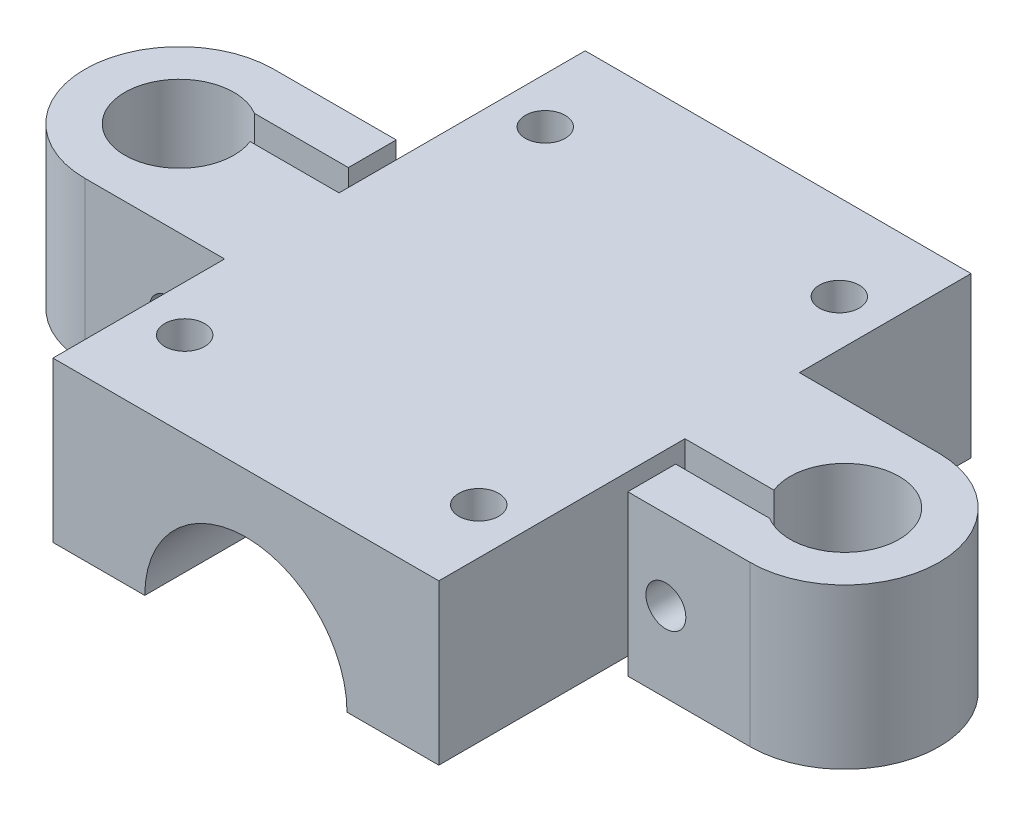
ISO-10303-21;
HEADER;
FILE_DESCRIPTION(('STEP AP214'),'2;1');
FILE_NAME('part.step','',(''),(''),'','','');
FILE_SCHEMA(('AUTOMOTIVE_DESIGN { 1 0 10303 214 1 1 1 1 }'));
ENDSEC;
DATA;
#1=APPLICATION_CONTEXT('core data for automotive mechanical design processes');
#2=APPLICATION_PROTOCOL_DEFINITION('international standard','automotive_design',2000,#1);
#3=PRODUCT_CONTEXT('',#1,'mechanical');
#4=PRODUCT('Part','Part','',(#3));
#5=PRODUCT_RELATED_PRODUCT_CATEGORY('part','',(#4));
#6=PRODUCT_DEFINITION_FORMATION('','',#4);
#7=PRODUCT_DEFINITION_CONTEXT('part definition',#1,'design');
#8=PRODUCT_DEFINITION('design','',#6,#7);
#9=PRODUCT_DEFINITION_SHAPE('','',#8);
#10=(LENGTH_UNIT() NAMED_UNIT(*) SI_UNIT(.MILLI.,.METRE.));
#11=(NAMED_UNIT(*) PLANE_ANGLE_UNIT() SI_UNIT($,.RADIAN.));
#12=(NAMED_UNIT(*) SI_UNIT($,.STERADIAN.) SOLID_ANGLE_UNIT());
#13=UNCERTAINTY_MEASURE_WITH_UNIT(LENGTH_MEASURE(1.E-05),#10,'distance_accuracy_value','');
#14=(GEOMETRIC_REPRESENTATION_CONTEXT(3) GLOBAL_UNCERTAINTY_ASSIGNED_CONTEXT((#13)) GLOBAL_UNIT_ASSIGNED_CONTEXT((#10,
#11,#12)) REPRESENTATION_CONTEXT('',''));
#15=CARTESIAN_POINT('',(0.,0.,0.));
#16=DIRECTION('',(0.,0.,1.));
#17=DIRECTION('',(1.,0.,0.));
#18=AXIS2_PLACEMENT_3D('',#15,#16,#17);
#19=CARTESIAN_POINT('',(0.,0.,-20.));
#20=DIRECTION('',(1.,0.,0.));
#21=DIRECTION('',(0.,0.,-1.));
#22=AXIS2_PLACEMENT_3D('',#19,#20,#21);
#23=PLANE('',#22);
#24=DIRECTION('',(0.,1.,0.));
#25=VECTOR('',#24,1.);
#26=CARTESIAN_POINT('',(0.,-22.6141548592911,7.1));
#27=LINE('',#26,#25);
#28=CARTESIAN_POINT('',(0.,0.,7.1));
#29=VERTEX_POINT('',#28);
#30=CARTESIAN_POINT('',(0.,12.,7.1));
#31=VERTEX_POINT('',#30);
#32=EDGE_CURVE('E72',#29,#31,#27,.T.);
#33=ORIENTED_EDGE('',*,*,#32,.F.);
#34=DIRECTION('',(0.,0.,1.));
#35=VECTOR('',#34,1.);
#36=CARTESIAN_POINT('',(0.,0.,-20.));
#37=LINE('',#36,#35);
#38=CARTESIAN_POINT('',(0.,0.,20.));
#39=VERTEX_POINT('',#38);
#40=EDGE_CURVE('E345',#29,#39,#37,.T.);
#41=ORIENTED_EDGE('',*,*,#40,.T.);
#42=DIRECTION('',(0.,1.,0.));
#43=VECTOR('',#42,1.);
#44=CARTESIAN_POINT('',(0.,0.,20.));
#45=LINE('',#44,#43);
#46=CARTESIAN_POINT('',(0.,12.,20.));
#47=VERTEX_POINT('',#46);
#48=EDGE_CURVE('E322',#39,#47,#45,.T.);
#49=ORIENTED_EDGE('',*,*,#48,.T.);
#50=DIRECTION('',(0.,0.,1.));
#51=VECTOR('',#50,1.);
#52=CARTESIAN_POINT('',(0.,12.,-20.));
#53=LINE('',#52,#51);
#54=EDGE_CURVE('E348',#31,#47,#53,.T.);
#55=ORIENTED_EDGE('',*,*,#54,.F.);
#56=EDGE_LOOP('',(#33,#41,#49,#55));
#57=FACE_BOUND('',#56,.T.);
#58=ADVANCED_FACE('F47',(#57),#23,.F.);
#59=CARTESIAN_POINT('',(29.,0.,-20.));
#60=DIRECTION('',(1.,0.,0.));
#61=DIRECTION('',(0.,0.,-1.));
#62=AXIS2_PLACEMENT_3D('',#59,#60,#61);
#63=PLANE('',#62);
#64=DIRECTION('',(0.,0.,1.));
#65=VECTOR('',#64,1.);
#66=CARTESIAN_POINT('',(29.,0.,-20.));
#67=LINE('',#66,#65);
#68=CARTESIAN_POINT('',(29.,0.,1.49999999999999));
#69=VERTEX_POINT('',#68);
#70=CARTESIAN_POINT('',(29.,0.,20.));
#71=VERTEX_POINT('',#70);
#72=EDGE_CURVE('E355',#69,#71,#67,.T.);
#73=ORIENTED_EDGE('',*,*,#72,.F.);
#74=DIRECTION('',(0.,1.,0.));
#75=VECTOR('',#74,1.);
#76=CARTESIAN_POINT('',(29.,-22.6141548592911,1.5));
#77=LINE('',#76,#75);
#78=CARTESIAN_POINT('',(29.,12.,1.49999999999999));
#79=VERTEX_POINT('',#78);
#80=EDGE_CURVE('E260',#69,#79,#77,.T.);
#81=ORIENTED_EDGE('',*,*,#80,.T.);
#82=DIRECTION('',(0.,0.,1.));
#83=VECTOR('',#82,1.);
#84=CARTESIAN_POINT('',(29.,12.,-20.));
#85=LINE('',#84,#83);
#86=CARTESIAN_POINT('',(29.,12.,20.));
#87=VERTEX_POINT('',#86);
#88=EDGE_CURVE('E351',#79,#87,#85,.T.);
#89=ORIENTED_EDGE('',*,*,#88,.T.);
#90=DIRECTION('',(0.,1.,0.));
#91=VECTOR('',#90,1.);
#92=CARTESIAN_POINT('',(29.,0.,20.));
#93=LINE('',#92,#91);
#94=EDGE_CURVE('E316',#71,#87,#93,.T.);
#95=ORIENTED_EDGE('',*,*,#94,.F.);
#96=EDGE_LOOP('',(#73,#81,#89,#95));
#97=FACE_BOUND('',#96,.T.);
#98=ADVANCED_FACE('F414',(#97),#63,.T.);
#99=CARTESIAN_POINT('',(14.5,0.,-20.));
#100=DIRECTION('',(0.,0.,1.));
#101=DIRECTION('',(1.,0.,0.));
#102=AXIS2_PLACEMENT_3D('',#99,#100,#101);
#103=CYLINDRICAL_SURFACE('',#102,7.6);
#104=DIRECTION('',(0.,0.,1.));
#105=VECTOR('',#104,1.);
#106=CARTESIAN_POINT('',(22.1,0.,-20.));
#107=LINE('',#106,#105);
#108=CARTESIAN_POINT('',(22.1,0.,-20.));
#109=VERTEX_POINT('',#108);
#110=CARTESIAN_POINT('',(22.1,0.,20.));
#111=VERTEX_POINT('',#110);
#112=EDGE_CURVE('E342',#109,#111,#107,.T.);
#113=ORIENTED_EDGE('',*,*,#112,.T.);
#114=CARTESIAN_POINT('',(14.5,0.,20.));
#115=DIRECTION('',(0.,0.,1.));
#116=DIRECTION('',(1.,0.,0.));
#117=AXIS2_PLACEMENT_3D('',#114,#115,#116);
#118=CIRCLE('',#117,7.6);
#119=CARTESIAN_POINT('',(6.9,0.,20.));
#120=VERTEX_POINT('',#119);
#121=EDGE_CURVE('E224',#111,#120,#118,.T.);
#122=ORIENTED_EDGE('',*,*,#121,.T.);
#123=DIRECTION('',(0.,0.,1.));
#124=VECTOR('',#123,1.);
#125=CARTESIAN_POINT('',(6.9,0.,-20.));
#126=LINE('',#125,#124);
#127=CARTESIAN_POINT('',(6.9,0.,-20.));
#128=VERTEX_POINT('',#127);
#129=EDGE_CURVE('E11',#128,#120,#126,.T.);
#130=ORIENTED_EDGE('',*,*,#129,.F.);
#131=CARTESIAN_POINT('',(14.5,0.,-20.));
#132=DIRECTION('',(0.,0.,1.));
#133=DIRECTION('',(1.,0.,0.));
#134=AXIS2_PLACEMENT_3D('',#131,#132,#133);
#135=CIRCLE('',#134,7.6);
#136=EDGE_CURVE('E328',#109,#128,#135,.T.);
#137=ORIENTED_EDGE('',*,*,#136,.F.);
#138=EDGE_LOOP('',(#113,#122,#130,#137));
#139=FACE_BOUND('',#138,.T.);
#140=ADVANCED_FACE('F49',(#139),#103,.F.);
#141=CARTESIAN_POINT('',(0.,0.,-20.));
#142=DIRECTION('',(0.,-1.,0.));
#143=DIRECTION('',(1.,0.,0.));
#144=AXIS2_PLACEMENT_3D('',#141,#142,#143);
#145=PLANE('',#144);
#146=CARTESIAN_POINT('',(3.45,0.,-13.55));
#147=DIRECTION('',(0.,-1.,0.));
#148=DIRECTION('',(1.,0.,0.));
#149=AXIS2_PLACEMENT_3D('',#146,#147,#148);
#150=CIRCLE('',#149,1.5);
#151=CARTESIAN_POINT('',(4.95,0.,-13.55));
#152=VERTEX_POINT('',#151);
#153=EDGE_CURVE('E510',#152,#152,#150,.T.);
#154=ORIENTED_EDGE('',*,*,#153,.F.);
#155=EDGE_LOOP('',(#154));
#156=FACE_BOUND('',#155,.T.);
#157=CARTESIAN_POINT('',(3.45,0.,13.55));
#158=DIRECTION('',(0.,-1.,0.));
#159=DIRECTION('',(1.,0.,0.));
#160=AXIS2_PLACEMENT_3D('',#157,#158,#159);
#161=CIRCLE('',#160,1.5);
#162=CARTESIAN_POINT('',(4.95,0.,13.55));
#163=VERTEX_POINT('',#162);
#164=EDGE_CURVE('E503',#163,#163,#161,.T.);
#165=ORIENTED_EDGE('',*,*,#164,.F.);
#166=EDGE_LOOP('',(#165));
#167=FACE_BOUND('',#166,.T.);
#168=ORIENTED_EDGE('',*,*,#129,.T.);
#169=DIRECTION('',(1.,0.,0.));
#170=VECTOR('',#169,1.);
#171=CARTESIAN_POINT('',(0.,0.,20.));
#172=LINE('',#171,#170);
#173=EDGE_CURVE('E325',#39,#120,#172,.T.);
#174=ORIENTED_EDGE('',*,*,#173,.F.);
#175=ORIENTED_EDGE('',*,*,#40,.F.);
#176=DIRECTION('',(1.,0.,0.));
#177=VECTOR('',#176,1.);
#178=CARTESIAN_POINT('',(0.,0.,7.10000000000001));
#179=LINE('',#178,#177);
#180=CARTESIAN_POINT('',(-10.5,0.,7.10000000000001));
#181=VERTEX_POINT('',#180);
#182=EDGE_CURVE('E238',#181,#29,#179,.T.);
#183=ORIENTED_EDGE('',*,*,#182,.F.);
#184=CARTESIAN_POINT('',(-10.5,0.,0.));
#185=DIRECTION('',(0.,-1.,0.));
#186=DIRECTION('',(1.,0.,0.));
#187=AXIS2_PLACEMENT_3D('',#184,#185,#186);
#188=CIRCLE('',#187,7.1);
#189=CARTESIAN_POINT('',(-10.5,0.,-7.09999999999999));
#190=VERTEX_POINT('',#189);
#191=EDGE_CURVE('E235',#190,#181,#188,.F.);
#192=ORIENTED_EDGE('',*,*,#191,.F.);
#193=DIRECTION('',(1.,0.,0.));
#194=VECTOR('',#193,1.);
#195=CARTESIAN_POINT('',(0.,0.,-7.09999999999999));
#196=LINE('',#195,#194);
#197=CARTESIAN_POINT('',(-1.3,0.,-7.09999999999999));
#198=VERTEX_POINT('',#197);
#199=EDGE_CURVE('E223',#190,#198,#196,.T.);
#200=ORIENTED_EDGE('',*,*,#199,.T.);
#201=DIRECTION('',(0.,0.,1.));
#202=VECTOR('',#201,1.);
#203=CARTESIAN_POINT('',(-1.3,0.,0.));
#204=LINE('',#203,#202);
#205=CARTESIAN_POINT('',(-1.3,0.,-3.5));
#206=VERTEX_POINT('',#205);
#207=EDGE_CURVE('E201',#198,#206,#204,.T.);
#208=ORIENTED_EDGE('',*,*,#207,.T.);
#209=DIRECTION('',(-1.,0.,0.));
#210=VECTOR('',#209,1.);
#211=CARTESIAN_POINT('',(0.,0.,-3.5));
#212=LINE('',#211,#210);
#213=CARTESIAN_POINT('',(-8.36458434959376,0.,-3.5));
#214=VERTEX_POINT('',#213);
#215=EDGE_CURVE('E211',#206,#214,#212,.T.);
#216=ORIENTED_EDGE('',*,*,#215,.T.);
#217=CARTESIAN_POINT('',(-10.5,0.,0.));
#218=DIRECTION('',(0.,-1.,0.));
#219=DIRECTION('',(1.,0.,0.));
#220=AXIS2_PLACEMENT_3D('',#217,#218,#219);
#221=CIRCLE('',#220,4.1);
#222=CARTESIAN_POINT('',(-6.68424319433222,0.,-1.5));
#223=VERTEX_POINT('',#222);
#224=EDGE_CURVE('E217',#214,#223,#221,.F.);
#225=ORIENTED_EDGE('',*,*,#224,.T.);
#226=DIRECTION('',(1.,0.,0.));
#227=VECTOR('',#226,1.);
#228=CARTESIAN_POINT('',(0.,0.,-1.5));
#229=LINE('',#228,#227);
#230=CARTESIAN_POINT('',(0.,0.,-1.5));
#231=VERTEX_POINT('',#230);
#232=EDGE_CURVE('E229',#223,#231,#229,.T.);
#233=ORIENTED_EDGE('',*,*,#232,.T.);
#234=CARTESIAN_POINT('',(0.,0.,-20.));
#235=VERTEX_POINT('',#234);
#236=EDGE_CURVE('E56',#235,#231,#37,.T.);
#237=ORIENTED_EDGE('',*,*,#236,.F.);
#238=DIRECTION('',(1.,0.,0.));
#239=VECTOR('',#238,1.);
#240=CARTESIAN_POINT('',(0.,0.,-20.));
#241=LINE('',#240,#239);
#242=EDGE_CURVE('E340',#235,#128,#241,.T.);
#243=ORIENTED_EDGE('',*,*,#242,.T.);
#244=EDGE_LOOP('',(#168,#174,#175,#183,#192,#200,#208,#216,#225,#233,#237,#243));
#245=FACE_BOUND('',#244,.T.);
#246=ADVANCED_FACE('F221',(#156,#167,#245),#145,.T.);
#247=ORIENTED_EDGE('',*,*,#236,.T.);
#248=DIRECTION('',(0.,1.,0.));
#249=VECTOR('',#248,1.);
#250=CARTESIAN_POINT('',(0.,-22.6141548592911,-1.5));
#251=LINE('',#250,#249);
#252=CARTESIAN_POINT('',(0.,12.,-1.5));
#253=VERTEX_POINT('',#252);
#254=EDGE_CURVE('E64',#231,#253,#251,.T.);
#255=ORIENTED_EDGE('',*,*,#254,.T.);
#256=CARTESIAN_POINT('',(0.,12.,-20.));
#257=VERTEX_POINT('',#256);
#258=EDGE_CURVE('E346',#257,#253,#53,.T.);
#259=ORIENTED_EDGE('',*,*,#258,.F.);
#260=DIRECTION('',(0.,1.,0.));
#261=VECTOR('',#260,1.);
#262=CARTESIAN_POINT('',(0.,0.,-20.));
#263=LINE('',#262,#261);
#264=EDGE_CURVE('E338',#235,#257,#263,.T.);
#265=ORIENTED_EDGE('',*,*,#264,.F.);
#266=EDGE_LOOP('',(#247,#255,#259,#265));
#267=FACE_BOUND('',#266,.T.);
#268=ADVANCED_FACE('F416',(#267),#23,.F.);
#269=CARTESIAN_POINT('',(0.,12.,-20.));
#270=DIRECTION('',(0.,-1.,0.));
#271=DIRECTION('',(0.,0.,-1.));
#272=AXIS2_PLACEMENT_3D('',#269,#270,#271);
#273=PLANE('',#272);
#274=CARTESIAN_POINT('',(25.55,12.,13.55));
#275=DIRECTION('',(0.,-1.,0.));
#276=DIRECTION('',(1.,0.,0.));
#277=AXIS2_PLACEMENT_3D('',#274,#275,#276);
#278=CIRCLE('',#277,1.5);
#279=CARTESIAN_POINT('',(27.05,12.,13.55));
#280=VERTEX_POINT('',#279);
#281=EDGE_CURVE('E519',#280,#280,#278,.T.);
#282=ORIENTED_EDGE('',*,*,#281,.T.);
#283=EDGE_LOOP('',(#282));
#284=FACE_BOUND('',#283,.T.);
#285=CARTESIAN_POINT('',(3.45,12.,-13.55));
#286=DIRECTION('',(0.,-1.,0.));
#287=DIRECTION('',(1.,0.,0.));
#288=AXIS2_PLACEMENT_3D('',#285,#286,#287);
#289=CIRCLE('',#288,1.5);
#290=CARTESIAN_POINT('',(4.94999999999999,12.,-13.55));
#291=VERTEX_POINT('',#290);
#292=EDGE_CURVE('E515',#291,#291,#289,.T.);
#293=ORIENTED_EDGE('',*,*,#292,.T.);
#294=EDGE_LOOP('',(#293));
#295=FACE_BOUND('',#294,.T.);
#296=CARTESIAN_POINT('',(25.55,12.,-13.55));
#297=DIRECTION('',(0.,-1.,0.));
#298=DIRECTION('',(1.,0.,0.));
#299=AXIS2_PLACEMENT_3D('',#296,#297,#298);
#300=CIRCLE('',#299,1.5);
#301=CARTESIAN_POINT('',(27.05,12.,-13.55));
#302=VERTEX_POINT('',#301);
#303=EDGE_CURVE('E504',#302,#302,#300,.T.);
#304=ORIENTED_EDGE('',*,*,#303,.T.);
#305=EDGE_LOOP('',(#304));
#306=FACE_BOUND('',#305,.T.);
#307=CARTESIAN_POINT('',(3.45,12.,13.55));
#308=DIRECTION('',(0.,-1.,0.));
#309=DIRECTION('',(1.,0.,0.));
#310=AXIS2_PLACEMENT_3D('',#307,#308,#309);
#311=CIRCLE('',#310,1.5);
#312=CARTESIAN_POINT('',(4.94999999999999,12.,13.55));
#313=VERTEX_POINT('',#312);
#314=EDGE_CURVE('E507',#313,#313,#311,.T.);
#315=ORIENTED_EDGE('',*,*,#314,.T.);
#316=EDGE_LOOP('',(#315));
#317=FACE_BOUND('',#316,.T.);
#318=ORIENTED_EDGE('',*,*,#258,.T.);
#319=DIRECTION('',(1.,0.,0.));
#320=VECTOR('',#319,1.);
#321=CARTESIAN_POINT('',(0.,12.,-1.5));
#322=LINE('',#321,#320);
#323=CARTESIAN_POINT('',(-6.68424319433222,12.,-1.5));
#324=VERTEX_POINT('',#323);
#325=EDGE_CURVE('E246',#324,#253,#322,.T.);
#326=ORIENTED_EDGE('',*,*,#325,.F.);
#327=CARTESIAN_POINT('',(-10.5,12.,0.));
#328=DIRECTION('',(0.,1.,0.));
#329=DIRECTION('',(0.,0.,1.));
#330=AXIS2_PLACEMENT_3D('',#327,#328,#329);
#331=CIRCLE('',#330,4.1);
#332=CARTESIAN_POINT('',(-8.36458434959376,12.,-3.5));
#333=VERTEX_POINT('',#332);
#334=EDGE_CURVE('E232',#333,#324,#331,.T.);
#335=ORIENTED_EDGE('',*,*,#334,.F.);
#336=DIRECTION('',(-1.,0.,0.));
#337=VECTOR('',#336,1.);
#338=CARTESIAN_POINT('',(0.,12.,-3.5));
#339=LINE('',#338,#337);
#340=CARTESIAN_POINT('',(-1.3,12.,-3.5));
#341=VERTEX_POINT('',#340);
#342=EDGE_CURVE('E208',#341,#333,#339,.T.);
#343=ORIENTED_EDGE('',*,*,#342,.F.);
#344=DIRECTION('',(0.,0.,1.));
#345=VECTOR('',#344,1.);
#346=CARTESIAN_POINT('',(-1.3,12.,0.));
#347=LINE('',#346,#345);
#348=CARTESIAN_POINT('',(-1.3,12.,-7.09999999999999));
#349=VERTEX_POINT('',#348);
#350=EDGE_CURVE('E204',#349,#341,#347,.T.);
#351=ORIENTED_EDGE('',*,*,#350,.F.);
#352=DIRECTION('',(1.,0.,0.));
#353=VECTOR('',#352,1.);
#354=CARTESIAN_POINT('',(0.,12.,-7.09999999999999));
#355=LINE('',#354,#353);
#356=CARTESIAN_POINT('',(-10.5,12.,-7.09999999999999));
#357=VERTEX_POINT('',#356);
#358=EDGE_CURVE('E252',#357,#349,#355,.T.);
#359=ORIENTED_EDGE('',*,*,#358,.F.);
#360=CARTESIAN_POINT('',(-10.5,12.,0.));
#361=DIRECTION('',(0.,1.,0.));
#362=DIRECTION('',(0.,0.,1.));
#363=AXIS2_PLACEMENT_3D('',#360,#361,#362);
#364=CIRCLE('',#363,7.1);
#365=CARTESIAN_POINT('',(-10.5,12.,7.10000000000001));
#366=VERTEX_POINT('',#365);
#367=EDGE_CURVE('E383',#357,#366,#364,.T.);
#368=ORIENTED_EDGE('',*,*,#367,.T.);
#369=DIRECTION('',(1.,0.,0.));
#370=VECTOR('',#369,1.);
#371=CARTESIAN_POINT('',(0.,12.,7.10000000000001));
#372=LINE('',#371,#370);
#373=EDGE_CURVE('E218',#366,#31,#372,.T.);
#374=ORIENTED_EDGE('',*,*,#373,.T.);
#375=ORIENTED_EDGE('',*,*,#54,.T.);
#376=DIRECTION('',(1.,0.,0.));
#377=VECTOR('',#376,1.);
#378=CARTESIAN_POINT('',(0.,12.,20.));
#379=LINE('',#378,#377);
#380=EDGE_CURVE('E319',#47,#87,#379,.T.);
#381=ORIENTED_EDGE('',*,*,#380,.T.);
#382=ORIENTED_EDGE('',*,*,#88,.F.);
#383=DIRECTION('',(-1.,0.,0.));
#384=VECTOR('',#383,1.);
#385=CARTESIAN_POINT('',(0.,12.,1.5));
#386=LINE('',#385,#384);
#387=CARTESIAN_POINT('',(35.6842431943322,12.,1.5));
#388=VERTEX_POINT('',#387);
#389=EDGE_CURVE('E257',#388,#79,#386,.T.);
#390=ORIENTED_EDGE('',*,*,#389,.F.);
#391=CARTESIAN_POINT('',(39.5,12.,0.));
#392=DIRECTION('',(0.,1.,0.));
#393=DIRECTION('',(0.,0.,1.));
#394=AXIS2_PLACEMENT_3D('',#391,#392,#393);
#395=CIRCLE('',#394,4.1);
#396=CARTESIAN_POINT('',(37.3645843495937,12.,3.49999999999999));
#397=VERTEX_POINT('',#396);
#398=EDGE_CURVE('E282',#397,#388,#395,.T.);
#399=ORIENTED_EDGE('',*,*,#398,.F.);
#400=DIRECTION('',(1.,0.,0.));
#401=VECTOR('',#400,1.);
#402=CARTESIAN_POINT('',(0.,12.,3.5));
#403=LINE('',#402,#401);
#404=CARTESIAN_POINT('',(30.3,12.,3.5));
#405=VERTEX_POINT('',#404);
#406=EDGE_CURVE('E274',#405,#397,#403,.T.);
#407=ORIENTED_EDGE('',*,*,#406,.F.);
#408=DIRECTION('',(0.,0.,-1.));
#409=VECTOR('',#408,1.);
#410=CARTESIAN_POINT('',(30.3,12.,0.));
#411=LINE('',#410,#409);
#412=CARTESIAN_POINT('',(30.3,12.,7.1));
#413=VERTEX_POINT('',#412);
#414=EDGE_CURVE('E275',#413,#405,#411,.T.);
#415=ORIENTED_EDGE('',*,*,#414,.F.);
#416=DIRECTION('',(1.,0.,0.));
#417=VECTOR('',#416,1.);
#418=CARTESIAN_POINT('',(0.,12.,7.10000000000001));
#419=LINE('',#418,#417);
#420=CARTESIAN_POINT('',(39.5,12.,7.09999999999999));
#421=VERTEX_POINT('',#420);
#422=EDGE_CURVE('E271',#413,#421,#419,.T.);
#423=ORIENTED_EDGE('',*,*,#422,.T.);
#424=CARTESIAN_POINT('',(39.5,12.,0.));
#425=DIRECTION('',(0.,1.,0.));
#426=DIRECTION('',(0.,0.,1.));
#427=AXIS2_PLACEMENT_3D('',#424,#425,#426);
#428=CIRCLE('',#427,7.1);
#429=CARTESIAN_POINT('',(39.5,12.,-7.10000000000001));
#430=VERTEX_POINT('',#429);
#431=EDGE_CURVE('E267',#421,#430,#428,.T.);
#432=ORIENTED_EDGE('',*,*,#431,.T.);
#433=DIRECTION('',(1.,0.,0.));
#434=VECTOR('',#433,1.);
#435=CARTESIAN_POINT('',(0.,12.,-7.09999999999999));
#436=LINE('',#435,#434);
#437=CARTESIAN_POINT('',(29.,12.,-7.1));
#438=VERTEX_POINT('',#437);
#439=EDGE_CURVE('E262',#438,#430,#436,.T.);
#440=ORIENTED_EDGE('',*,*,#439,.F.);
#441=CARTESIAN_POINT('',(29.,12.,-20.));
#442=VERTEX_POINT('',#441);
#443=EDGE_CURVE('E349',#442,#438,#85,.T.);
#444=ORIENTED_EDGE('',*,*,#443,.F.);
#445=DIRECTION('',(1.,0.,0.));
#446=VECTOR('',#445,1.);
#447=CARTESIAN_POINT('',(0.,12.,-20.));
#448=LINE('',#447,#446);
#449=EDGE_CURVE('E336',#257,#442,#448,.T.);
#450=ORIENTED_EDGE('',*,*,#449,.F.);
#451=EDGE_LOOP('',(#318,#326,#335,#343,#351,#359,#368,#374,#375,#381,#382,#390,#399,#407,#415,
#423,#432,#440,#444,#450));
#452=FACE_BOUND('',#451,.T.);
#453=ADVANCED_FACE('F392',(#284,#295,#306,#317,#452),#273,.F.);
#454=DIRECTION('',(0.,1.,0.));
#455=VECTOR('',#454,1.);
#456=CARTESIAN_POINT('',(29.,-22.6141548592911,-7.1));
#457=LINE('',#456,#455);
#458=CARTESIAN_POINT('',(29.,0.,-7.1));
#459=VERTEX_POINT('',#458);
#460=EDGE_CURVE('E266',#459,#438,#457,.T.);
#461=ORIENTED_EDGE('',*,*,#460,.F.);
#462=CARTESIAN_POINT('',(29.,0.,-20.));
#463=VERTEX_POINT('',#462);
#464=EDGE_CURVE('E352',#463,#459,#67,.T.);
#465=ORIENTED_EDGE('',*,*,#464,.F.);
#466=DIRECTION('',(0.,1.,0.));
#467=VECTOR('',#466,1.);
#468=CARTESIAN_POINT('',(29.,0.,-20.));
#469=LINE('',#468,#467);
#470=EDGE_CURVE('E333',#463,#442,#469,.T.);
#471=ORIENTED_EDGE('',*,*,#470,.T.);
#472=ORIENTED_EDGE('',*,*,#443,.T.);
#473=EDGE_LOOP('',(#461,#465,#471,#472));
#474=FACE_BOUND('',#473,.T.);
#475=ADVANCED_FACE('F423',(#474),#63,.T.);
#476=CARTESIAN_POINT('',(0.,0.,-20.));
#477=DIRECTION('',(0.,-1.,0.));
#478=DIRECTION('',(1.,0.,0.));
#479=AXIS2_PLACEMENT_3D('',#476,#477,#478);
#480=PLANE('',#479);
#481=CARTESIAN_POINT('',(25.55,0.,13.55));
#482=DIRECTION('',(0.,-1.,0.));
#483=DIRECTION('',(1.,0.,0.));
#484=AXIS2_PLACEMENT_3D('',#481,#482,#483);
#485=CIRCLE('',#484,1.5);
#486=CARTESIAN_POINT('',(27.05,0.,13.55));
#487=VERTEX_POINT('',#486);
#488=EDGE_CURVE('E498',#487,#487,#485,.T.);
#489=ORIENTED_EDGE('',*,*,#488,.F.);
#490=EDGE_LOOP('',(#489));
#491=FACE_BOUND('',#490,.T.);
#492=CARTESIAN_POINT('',(25.55,0.,-13.55));
#493=DIRECTION('',(0.,-1.,0.));
#494=DIRECTION('',(1.,0.,0.));
#495=AXIS2_PLACEMENT_3D('',#492,#493,#494);
#496=CIRCLE('',#495,1.5);
#497=CARTESIAN_POINT('',(27.05,0.,-13.55));
#498=VERTEX_POINT('',#497);
#499=EDGE_CURVE('E501',#498,#498,#496,.T.);
#500=ORIENTED_EDGE('',*,*,#499,.F.);
#501=EDGE_LOOP('',(#500));
#502=FACE_BOUND('',#501,.T.);
#503=ORIENTED_EDGE('',*,*,#464,.T.);
#504=DIRECTION('',(1.,0.,0.));
#505=VECTOR('',#504,1.);
#506=CARTESIAN_POINT('',(0.,0.,-7.09999999999999));
#507=LINE('',#506,#505);
#508=CARTESIAN_POINT('',(39.5,0.,-7.10000000000001));
#509=VERTEX_POINT('',#508);
#510=EDGE_CURVE('E288',#459,#509,#507,.T.);
#511=ORIENTED_EDGE('',*,*,#510,.T.);
#512=CARTESIAN_POINT('',(39.5,0.,0.));
#513=DIRECTION('',(0.,-1.,0.));
#514=DIRECTION('',(1.,0.,0.));
#515=AXIS2_PLACEMENT_3D('',#512,#513,#514);
#516=CIRCLE('',#515,7.1);
#517=CARTESIAN_POINT('',(39.5,0.,7.09999999999999));
#518=VERTEX_POINT('',#517);
#519=EDGE_CURVE('E265',#518,#509,#516,.F.);
#520=ORIENTED_EDGE('',*,*,#519,.F.);
#521=DIRECTION('',(1.,0.,0.));
#522=VECTOR('',#521,1.);
#523=CARTESIAN_POINT('',(0.,0.,7.10000000000001));
#524=LINE('',#523,#522);
#525=CARTESIAN_POINT('',(30.3,0.,7.1));
#526=VERTEX_POINT('',#525);
#527=EDGE_CURVE('E289',#526,#518,#524,.T.);
#528=ORIENTED_EDGE('',*,*,#527,.F.);
#529=DIRECTION('',(0.,0.,-1.));
#530=VECTOR('',#529,1.);
#531=CARTESIAN_POINT('',(30.3,0.,0.));
#532=LINE('',#531,#530);
#533=CARTESIAN_POINT('',(30.3,0.,3.5));
#534=VERTEX_POINT('',#533);
#535=EDGE_CURVE('E256',#526,#534,#532,.T.);
#536=ORIENTED_EDGE('',*,*,#535,.T.);
#537=DIRECTION('',(1.,0.,0.));
#538=VECTOR('',#537,1.);
#539=CARTESIAN_POINT('',(0.,0.,3.5));
#540=LINE('',#539,#538);
#541=CARTESIAN_POINT('',(37.3645843495937,0.,3.49999999999999));
#542=VERTEX_POINT('',#541);
#543=EDGE_CURVE('E270',#534,#542,#540,.T.);
#544=ORIENTED_EDGE('',*,*,#543,.T.);
#545=CARTESIAN_POINT('',(39.5,0.,0.));
#546=DIRECTION('',(0.,-1.,0.));
#547=DIRECTION('',(1.,0.,0.));
#548=AXIS2_PLACEMENT_3D('',#545,#546,#547);
#549=CIRCLE('',#548,4.1);
#550=CARTESIAN_POINT('',(35.6842431943322,0.,1.5));
#551=VERTEX_POINT('',#550);
#552=EDGE_CURVE('E299',#542,#551,#549,.F.);
#553=ORIENTED_EDGE('',*,*,#552,.T.);
#554=DIRECTION('',(-1.,0.,0.));
#555=VECTOR('',#554,1.);
#556=CARTESIAN_POINT('',(0.,0.,1.5));
#557=LINE('',#556,#555);
#558=EDGE_CURVE('E296',#551,#69,#557,.T.);
#559=ORIENTED_EDGE('',*,*,#558,.T.);
#560=ORIENTED_EDGE('',*,*,#72,.T.);
#561=DIRECTION('',(1.,0.,0.));
#562=VECTOR('',#561,1.);
#563=CARTESIAN_POINT('',(0.,0.,20.));
#564=LINE('',#563,#562);
#565=EDGE_CURVE('E227',#111,#71,#564,.T.);
#566=ORIENTED_EDGE('',*,*,#565,.F.);
#567=ORIENTED_EDGE('',*,*,#112,.F.);
#568=DIRECTION('',(1.,0.,0.));
#569=VECTOR('',#568,1.);
#570=CARTESIAN_POINT('',(0.,0.,-20.));
#571=LINE('',#570,#569);
#572=EDGE_CURVE('E330',#109,#463,#571,.T.);
#573=ORIENTED_EDGE('',*,*,#572,.T.);
#574=EDGE_LOOP('',(#503,#511,#520,#528,#536,#544,#553,#559,#560,#566,#567,#573));
#575=FACE_BOUND('',#574,.T.);
#576=ADVANCED_FACE('F450',(#491,#502,#575),#480,.T.);
#577=CARTESIAN_POINT('',(0.,0.,-20.));
#578=DIRECTION('',(0.,0.,1.));
#579=DIRECTION('',(1.,0.,0.));
#580=AXIS2_PLACEMENT_3D('',#577,#578,#579);
#581=PLANE('',#580);
#582=ORIENTED_EDGE('',*,*,#136,.T.);
#583=ORIENTED_EDGE('',*,*,#242,.F.);
#584=ORIENTED_EDGE('',*,*,#264,.T.);
#585=ORIENTED_EDGE('',*,*,#449,.T.);
#586=ORIENTED_EDGE('',*,*,#470,.F.);
#587=ORIENTED_EDGE('',*,*,#572,.F.);
#588=EDGE_LOOP('',(#582,#583,#584,#585,#586,#587));
#589=FACE_BOUND('',#588,.T.);
#590=ADVANCED_FACE('F437',(#589),#581,.F.);
#591=CARTESIAN_POINT('',(0.,0.,20.));
#592=DIRECTION('',(0.,0.,1.));
#593=DIRECTION('',(1.,0.,0.));
#594=AXIS2_PLACEMENT_3D('',#591,#592,#593);
#595=PLANE('',#594);
#596=ORIENTED_EDGE('',*,*,#121,.F.);
#597=ORIENTED_EDGE('',*,*,#565,.T.);
#598=ORIENTED_EDGE('',*,*,#94,.T.);
#599=ORIENTED_EDGE('',*,*,#380,.F.);
#600=ORIENTED_EDGE('',*,*,#48,.F.);
#601=ORIENTED_EDGE('',*,*,#173,.T.);
#602=EDGE_LOOP('',(#596,#597,#598,#599,#600,#601));
#603=FACE_BOUND('',#602,.T.);
#604=ADVANCED_FACE('F446',(#603),#595,.T.);
#605=CARTESIAN_POINT('',(39.5,-22.6141548592911,0.));
#606=DIRECTION('',(0.,1.,0.));
#607=DIRECTION('',(0.,0.,1.));
#608=AXIS2_PLACEMENT_3D('',#605,#606,#607);
#609=CYLINDRICAL_SURFACE('',#608,4.1);
#610=ORIENTED_EDGE('',*,*,#552,.F.);
#611=DIRECTION('',(0.,1.,0.));
#612=VECTOR('',#611,1.);
#613=CARTESIAN_POINT('',(37.3645843495937,-22.6141548592911,3.49999999999999));
#614=LINE('',#613,#612);
#615=EDGE_CURVE('E285',#542,#397,#614,.T.);
#616=ORIENTED_EDGE('',*,*,#615,.T.);
#617=ORIENTED_EDGE('',*,*,#398,.T.);
#618=DIRECTION('',(0.,1.,0.));
#619=VECTOR('',#618,1.);
#620=CARTESIAN_POINT('',(35.6842431943322,-22.6141548592911,1.5));
#621=LINE('',#620,#619);
#622=EDGE_CURVE('E261',#551,#388,#621,.T.);
#623=ORIENTED_EDGE('',*,*,#622,.F.);
#624=EDGE_LOOP('',(#610,#616,#617,#623));
#625=FACE_BOUND('',#624,.T.);
#626=ADVANCED_FACE('F461',(#625),#609,.F.);
#627=CARTESIAN_POINT('',(0.,-22.6141548592911,1.5));
#628=DIRECTION('',(0.,0.,-1.));
#629=DIRECTION('',(-1.,0.,0.));
#630=AXIS2_PLACEMENT_3D('',#627,#628,#629);
#631=PLANE('',#630);
#632=CARTESIAN_POINT('',(33.1642431943322,6.00000000000001,1.49999999999999));
#633=DIRECTION('',(0.,0.,-1.));
#634=DIRECTION('',(-1.,0.,0.));
#635=AXIS2_PLACEMENT_3D('',#632,#633,#634);
#636=CIRCLE('',#635,1.5);
#637=CARTESIAN_POINT('',(31.6642431943322,6.00000000000001,1.49999999999999));
#638=VERTEX_POINT('',#637);
#639=EDGE_CURVE('E359',#638,#638,#636,.T.);
#640=ORIENTED_EDGE('',*,*,#639,.T.);
#641=EDGE_LOOP('',(#640));
#642=FACE_BOUND('',#641,.T.);
#643=ORIENTED_EDGE('',*,*,#558,.F.);
#644=ORIENTED_EDGE('',*,*,#622,.T.);
#645=ORIENTED_EDGE('',*,*,#389,.T.);
#646=ORIENTED_EDGE('',*,*,#80,.F.);
#647=EDGE_LOOP('',(#643,#644,#645,#646));
#648=FACE_BOUND('',#647,.T.);
#649=ADVANCED_FACE('F457',(#642,#648),#631,.F.);
#650=CARTESIAN_POINT('',(0.,-22.6141548592911,-7.09999999999999));
#651=DIRECTION('',(0.,0.,1.));
#652=DIRECTION('',(1.,0.,0.));
#653=AXIS2_PLACEMENT_3D('',#650,#651,#652);
#654=PLANE('',#653);
#655=CARTESIAN_POINT('',(33.1642431943322,6.00000000000001,-7.10000000000001));
#656=DIRECTION('',(0.,0.,1.));
#657=DIRECTION('',(1.,0.,0.));
#658=AXIS2_PLACEMENT_3D('',#655,#656,#657);
#659=CIRCLE('',#658,1.5);
#660=CARTESIAN_POINT('',(34.6642431943322,6.00000000000001,-7.10000000000001));
#661=VERTEX_POINT('',#660);
#662=EDGE_CURVE('E366',#661,#661,#659,.T.);
#663=ORIENTED_EDGE('',*,*,#662,.T.);
#664=EDGE_LOOP('',(#663));
#665=FACE_BOUND('',#664,.T.);
#666=ORIENTED_EDGE('',*,*,#510,.F.);
#667=ORIENTED_EDGE('',*,*,#460,.T.);
#668=ORIENTED_EDGE('',*,*,#439,.T.);
#669=DIRECTION('',(0.,1.,0.));
#670=VECTOR('',#669,1.);
#671=CARTESIAN_POINT('',(39.5,-22.6141548592911,-7.10000000000001));
#672=LINE('',#671,#670);
#673=EDGE_CURVE('E292',#509,#430,#672,.T.);
#674=ORIENTED_EDGE('',*,*,#673,.F.);
#675=EDGE_LOOP('',(#666,#667,#668,#674));
#676=FACE_BOUND('',#675,.T.);
#677=ADVANCED_FACE('F482',(#665,#676),#654,.F.);
#678=CARTESIAN_POINT('',(39.5,-22.6141548592911,0.));
#679=DIRECTION('',(0.,1.,0.));
#680=DIRECTION('',(0.,0.,1.));
#681=AXIS2_PLACEMENT_3D('',#678,#679,#680);
#682=CYLINDRICAL_SURFACE('',#681,7.1);
#683=DIRECTION('',(0.,1.,0.));
#684=VECTOR('',#683,1.);
#685=CARTESIAN_POINT('',(39.5,-22.6141548592911,7.09999999999999));
#686=LINE('',#685,#684);
#687=EDGE_CURVE('E291',#518,#421,#686,.T.);
#688=ORIENTED_EDGE('',*,*,#687,.F.);
#689=ORIENTED_EDGE('',*,*,#519,.T.);
#690=ORIENTED_EDGE('',*,*,#673,.T.);
#691=ORIENTED_EDGE('',*,*,#431,.F.);
#692=EDGE_LOOP('',(#688,#689,#690,#691));
#693=FACE_BOUND('',#692,.T.);
#694=ADVANCED_FACE('F476',(#693),#682,.T.);
#695=CARTESIAN_POINT('',(0.,-22.6141548592911,7.10000000000001));
#696=DIRECTION('',(0.,0.,1.));
#697=DIRECTION('',(1.,0.,0.));
#698=AXIS2_PLACEMENT_3D('',#695,#696,#697);
#699=PLANE('',#698);
#700=CARTESIAN_POINT('',(33.1642431943322,6.00000000000001,7.1));
#701=DIRECTION('',(0.,0.,1.));
#702=DIRECTION('',(1.,0.,0.));
#703=AXIS2_PLACEMENT_3D('',#700,#701,#702);
#704=CIRCLE('',#703,1.5);
#705=CARTESIAN_POINT('',(34.6642431943322,6.00000000000001,7.09999999999999));
#706=VERTEX_POINT('',#705);
#707=EDGE_CURVE('E371',#706,#706,#704,.T.);
#708=ORIENTED_EDGE('',*,*,#707,.F.);
#709=EDGE_LOOP('',(#708));
#710=FACE_BOUND('',#709,.T.);
#711=DIRECTION('',(0.,1.,0.));
#712=VECTOR('',#711,1.);
#713=CARTESIAN_POINT('',(30.3,-22.6141548592911,7.1));
#714=LINE('',#713,#712);
#715=EDGE_CURVE('E279',#526,#413,#714,.T.);
#716=ORIENTED_EDGE('',*,*,#715,.F.);
#717=ORIENTED_EDGE('',*,*,#527,.T.);
#718=ORIENTED_EDGE('',*,*,#687,.T.);
#719=ORIENTED_EDGE('',*,*,#422,.F.);
#720=EDGE_LOOP('',(#716,#717,#718,#719));
#721=FACE_BOUND('',#720,.T.);
#722=ADVANCED_FACE('F471',(#710,#721),#699,.T.);
#723=CARTESIAN_POINT('',(30.3,-22.6141548592911,0.));
#724=DIRECTION('',(1.,0.,0.));
#725=DIRECTION('',(0.,0.,-1.));
#726=AXIS2_PLACEMENT_3D('',#723,#724,#725);
#727=PLANE('',#726);
#728=ORIENTED_EDGE('',*,*,#535,.F.);
#729=ORIENTED_EDGE('',*,*,#715,.T.);
#730=ORIENTED_EDGE('',*,*,#414,.T.);
#731=DIRECTION('',(0.,1.,0.));
#732=VECTOR('',#731,1.);
#733=CARTESIAN_POINT('',(30.3,-22.6141548592911,3.5));
#734=LINE('',#733,#732);
#735=EDGE_CURVE('E278',#534,#405,#734,.T.);
#736=ORIENTED_EDGE('',*,*,#735,.F.);
#737=EDGE_LOOP('',(#728,#729,#730,#736));
#738=FACE_BOUND('',#737,.T.);
#739=ADVANCED_FACE('F722',(#738),#727,.F.);
#740=CARTESIAN_POINT('',(0.,-22.6141548592911,3.5));
#741=DIRECTION('',(0.,0.,1.));
#742=DIRECTION('',(1.,0.,0.));
#743=AXIS2_PLACEMENT_3D('',#740,#741,#742);
#744=PLANE('',#743);
#745=CARTESIAN_POINT('',(33.1642431943322,6.00000000000001,3.5));
#746=DIRECTION('',(0.,0.,1.));
#747=DIRECTION('',(1.,0.,0.));
#748=AXIS2_PLACEMENT_3D('',#745,#746,#747);
#749=CIRCLE('',#748,1.5);
#750=CARTESIAN_POINT('',(34.6642431943322,6.00000000000001,3.5));
#751=VERTEX_POINT('',#750);
#752=EDGE_CURVE('E51',#751,#751,#749,.T.);
#753=ORIENTED_EDGE('',*,*,#752,.T.);
#754=EDGE_LOOP('',(#753));
#755=FACE_BOUND('',#754,.T.);
#756=ORIENTED_EDGE('',*,*,#543,.F.);
#757=ORIENTED_EDGE('',*,*,#735,.T.);
#758=ORIENTED_EDGE('',*,*,#406,.T.);
#759=ORIENTED_EDGE('',*,*,#615,.F.);
#760=EDGE_LOOP('',(#756,#757,#758,#759));
#761=FACE_BOUND('',#760,.T.);
#762=ADVANCED_FACE('F411',(#755,#761),#744,.F.);
#763=CARTESIAN_POINT('',(-10.5,-22.6141548592911,0.));
#764=DIRECTION('',(0.,1.,0.));
#765=DIRECTION('',(0.,0.,1.));
#766=AXIS2_PLACEMENT_3D('',#763,#764,#765);
#767=CYLINDRICAL_SURFACE('',#766,4.1);
#768=ORIENTED_EDGE('',*,*,#224,.F.);
#769=DIRECTION('',(0.,1.,0.));
#770=VECTOR('',#769,1.);
#771=CARTESIAN_POINT('',(-8.36458434959376,-22.6141548592911,-3.5));
#772=LINE('',#771,#770);
#773=EDGE_CURVE('E213',#214,#333,#772,.T.);
#774=ORIENTED_EDGE('',*,*,#773,.T.);
#775=ORIENTED_EDGE('',*,*,#334,.T.);
#776=DIRECTION('',(0.,1.,0.));
#777=VECTOR('',#776,1.);
#778=CARTESIAN_POINT('',(-6.68424319433222,-22.6141548592911,-1.5));
#779=LINE('',#778,#777);
#780=EDGE_CURVE('E244',#223,#324,#779,.T.);
#781=ORIENTED_EDGE('',*,*,#780,.F.);
#782=EDGE_LOOP('',(#768,#774,#775,#781));
#783=FACE_BOUND('',#782,.T.);
#784=ADVANCED_FACE('F395',(#783),#767,.F.);
#785=CARTESIAN_POINT('',(0.,-22.6141548592911,-1.5));
#786=DIRECTION('',(0.,0.,1.));
#787=DIRECTION('',(1.,0.,0.));
#788=AXIS2_PLACEMENT_3D('',#785,#786,#787);
#789=PLANE('',#788);
#790=CARTESIAN_POINT('',(-4.16424319433222,6.,-1.5));
#791=DIRECTION('',(0.,0.,1.));
#792=DIRECTION('',(1.,0.,0.));
#793=AXIS2_PLACEMENT_3D('',#790,#791,#792);
#794=CIRCLE('',#793,1.5);
#795=CARTESIAN_POINT('',(-2.66424319433222,6.,-1.5));
#796=VERTEX_POINT('',#795);
#797=EDGE_CURVE('E312',#796,#796,#794,.T.);
#798=ORIENTED_EDGE('',*,*,#797,.T.);
#799=EDGE_LOOP('',(#798));
#800=FACE_BOUND('',#799,.T.);
#801=ORIENTED_EDGE('',*,*,#232,.F.);
#802=ORIENTED_EDGE('',*,*,#780,.T.);
#803=ORIENTED_EDGE('',*,*,#325,.T.);
#804=ORIENTED_EDGE('',*,*,#254,.F.);
#805=EDGE_LOOP('',(#801,#802,#803,#804));
#806=FACE_BOUND('',#805,.T.);
#807=ADVANCED_FACE('F398',(#800,#806),#789,.F.);
#808=CARTESIAN_POINT('',(0.,-22.6141548592911,7.10000000000001));
#809=DIRECTION('',(0.,0.,1.));
#810=DIRECTION('',(1.,0.,0.));
#811=AXIS2_PLACEMENT_3D('',#808,#809,#810);
#812=PLANE('',#811);
#813=CARTESIAN_POINT('',(-4.16424319433222,6.,7.10000000000001));
#814=DIRECTION('',(0.,0.,1.));
#815=DIRECTION('',(1.,0.,0.));
#816=AXIS2_PLACEMENT_3D('',#813,#814,#815);
#817=CIRCLE('',#816,1.5);
#818=CARTESIAN_POINT('',(-2.66424319433222,6.,7.10000000000001));
#819=VERTEX_POINT('',#818);
#820=EDGE_CURVE('E363',#819,#819,#817,.T.);
#821=ORIENTED_EDGE('',*,*,#820,.F.);
#822=EDGE_LOOP('',(#821));
#823=FACE_BOUND('',#822,.T.);
#824=DIRECTION('',(0.,1.,0.));
#825=VECTOR('',#824,1.);
#826=CARTESIAN_POINT('',(-10.5,-22.6141548592911,7.10000000000001));
#827=LINE('',#826,#825);
#828=EDGE_CURVE('E237',#181,#366,#827,.T.);
#829=ORIENTED_EDGE('',*,*,#828,.F.);
#830=ORIENTED_EDGE('',*,*,#182,.T.);
#831=ORIENTED_EDGE('',*,*,#32,.T.);
#832=ORIENTED_EDGE('',*,*,#373,.F.);
#833=EDGE_LOOP('',(#829,#830,#831,#832));
#834=FACE_BOUND('',#833,.T.);
#835=ADVANCED_FACE('F400',(#823,#834),#812,.T.);
#836=CARTESIAN_POINT('',(-10.5,-22.6141548592911,0.));
#837=DIRECTION('',(0.,1.,0.));
#838=DIRECTION('',(0.,0.,1.));
#839=AXIS2_PLACEMENT_3D('',#836,#837,#838);
#840=CYLINDRICAL_SURFACE('',#839,7.1);
#841=DIRECTION('',(0.,1.,0.));
#842=VECTOR('',#841,1.);
#843=CARTESIAN_POINT('',(-10.5,-22.6141548592911,-7.09999999999999));
#844=LINE('',#843,#842);
#845=EDGE_CURVE('E250',#190,#357,#844,.T.);
#846=ORIENTED_EDGE('',*,*,#845,.F.);
#847=ORIENTED_EDGE('',*,*,#191,.T.);
#848=ORIENTED_EDGE('',*,*,#828,.T.);
#849=ORIENTED_EDGE('',*,*,#367,.F.);
#850=EDGE_LOOP('',(#846,#847,#848,#849));
#851=FACE_BOUND('',#850,.T.);
#852=ADVANCED_FACE('F407',(#851),#840,.T.);
#853=CARTESIAN_POINT('',(0.,-22.6141548592911,-7.09999999999999));
#854=DIRECTION('',(0.,0.,1.));
#855=DIRECTION('',(1.,0.,0.));
#856=AXIS2_PLACEMENT_3D('',#853,#854,#855);
#857=PLANE('',#856);
#858=CARTESIAN_POINT('',(-4.16424319433222,6.,-7.1));
#859=DIRECTION('',(0.,0.,1.));
#860=DIRECTION('',(1.,0.,0.));
#861=AXIS2_PLACEMENT_3D('',#858,#859,#860);
#862=CIRCLE('',#861,1.5);
#863=CARTESIAN_POINT('',(-2.66424319433222,6.,-7.1));
#864=VERTEX_POINT('',#863);
#865=EDGE_CURVE('E358',#864,#864,#862,.T.);
#866=ORIENTED_EDGE('',*,*,#865,.T.);
#867=EDGE_LOOP('',(#866));
#868=FACE_BOUND('',#867,.T.);
#869=ORIENTED_EDGE('',*,*,#199,.F.);
#870=ORIENTED_EDGE('',*,*,#845,.T.);
#871=ORIENTED_EDGE('',*,*,#358,.T.);
#872=DIRECTION('',(0.,1.,0.));
#873=VECTOR('',#872,1.);
#874=CARTESIAN_POINT('',(-1.3,-22.6141548592911,-7.09999999999999));
#875=LINE('',#874,#873);
#876=EDGE_CURVE('E253',#198,#349,#875,.T.);
#877=ORIENTED_EDGE('',*,*,#876,.F.);
#878=EDGE_LOOP('',(#869,#870,#871,#877));
#879=FACE_BOUND('',#878,.T.);
#880=ADVANCED_FACE('F552',(#868,#879),#857,.F.);
#881=CARTESIAN_POINT('',(-1.3,-22.6141548592911,0.));
#882=DIRECTION('',(-1.,0.,0.));
#883=DIRECTION('',(0.,0.,1.));
#884=AXIS2_PLACEMENT_3D('',#881,#882,#883);
#885=PLANE('',#884);
#886=ORIENTED_EDGE('',*,*,#207,.F.);
#887=ORIENTED_EDGE('',*,*,#876,.T.);
#888=ORIENTED_EDGE('',*,*,#350,.T.);
#889=DIRECTION('',(0.,1.,0.));
#890=VECTOR('',#889,1.);
#891=CARTESIAN_POINT('',(-1.3,-22.6141548592911,-3.5));
#892=LINE('',#891,#890);
#893=EDGE_CURVE('E197',#206,#341,#892,.T.);
#894=ORIENTED_EDGE('',*,*,#893,.F.);
#895=EDGE_LOOP('',(#886,#887,#888,#894));
#896=FACE_BOUND('',#895,.T.);
#897=ADVANCED_FACE('F199',(#896),#885,.F.);
#898=CARTESIAN_POINT('',(0.,-22.6141548592911,-3.5));
#899=DIRECTION('',(0.,0.,-1.));
#900=DIRECTION('',(-1.,0.,0.));
#901=AXIS2_PLACEMENT_3D('',#898,#899,#900);
#902=PLANE('',#901);
#903=CARTESIAN_POINT('',(-4.16424319433222,6.,-3.5));
#904=DIRECTION('',(0.,0.,-1.));
#905=DIRECTION('',(-1.,0.,0.));
#906=AXIS2_PLACEMENT_3D('',#903,#904,#905);
#907=CIRCLE('',#906,1.5);
#908=CARTESIAN_POINT('',(-5.66424319433222,6.,-3.5));
#909=VERTEX_POINT('',#908);
#910=EDGE_CURVE('E356',#909,#909,#907,.T.);
#911=ORIENTED_EDGE('',*,*,#910,.T.);
#912=EDGE_LOOP('',(#911));
#913=FACE_BOUND('',#912,.T.);
#914=ORIENTED_EDGE('',*,*,#215,.F.);
#915=ORIENTED_EDGE('',*,*,#893,.T.);
#916=ORIENTED_EDGE('',*,*,#342,.T.);
#917=ORIENTED_EDGE('',*,*,#773,.F.);
#918=EDGE_LOOP('',(#914,#915,#916,#917));
#919=FACE_BOUND('',#918,.T.);
#920=ADVANCED_FACE('F212',(#913,#919),#902,.F.);
#921=CARTESIAN_POINT('',(-4.16424319433222,6.,20.));
#922=DIRECTION('',(0.,0.,-1.));
#923=DIRECTION('',(-1.,0.,0.));
#924=AXIS2_PLACEMENT_3D('',#921,#922,#923);
#925=CYLINDRICAL_SURFACE('',#924,1.5);
#926=ORIENTED_EDGE('',*,*,#910,.F.);
#927=EDGE_LOOP('',(#926));
#928=FACE_BOUND('',#927,.T.);
#929=ORIENTED_EDGE('',*,*,#865,.F.);
#930=EDGE_LOOP('',(#929));
#931=FACE_BOUND('',#930,.T.);
#932=ADVANCED_FACE('F542',(#928,#931),#925,.F.);
#933=ORIENTED_EDGE('',*,*,#820,.T.);
#934=EDGE_LOOP('',(#933));
#935=FACE_BOUND('',#934,.T.);
#936=ORIENTED_EDGE('',*,*,#797,.F.);
#937=EDGE_LOOP('',(#936));
#938=FACE_BOUND('',#937,.T.);
#939=ADVANCED_FACE('F533',(#935,#938),#925,.F.);
#940=CARTESIAN_POINT('',(33.1642431943322,6.00000000000001,-20.));
#941=DIRECTION('',(0.,0.,1.));
#942=DIRECTION('',(1.,0.,0.));
#943=AXIS2_PLACEMENT_3D('',#940,#941,#942);
#944=CYLINDRICAL_SURFACE('',#943,1.5);
#945=ORIENTED_EDGE('',*,*,#707,.T.);
#946=EDGE_LOOP('',(#945));
#947=FACE_BOUND('',#946,.T.);
#948=ORIENTED_EDGE('',*,*,#752,.F.);
#949=EDGE_LOOP('',(#948));
#950=FACE_BOUND('',#949,.T.);
#951=ADVANCED_FACE('F530',(#947,#950),#944,.F.);
#952=ORIENTED_EDGE('',*,*,#662,.F.);
#953=EDGE_LOOP('',(#952));
#954=FACE_BOUND('',#953,.T.);
#955=ORIENTED_EDGE('',*,*,#639,.F.);
#956=EDGE_LOOP('',(#955));
#957=FACE_BOUND('',#956,.T.);
#958=ADVANCED_FACE('F532',(#954,#957),#944,.F.);
#959=CARTESIAN_POINT('',(25.55,12.,-13.55));
#960=DIRECTION('',(0.,-1.,0.));
#961=DIRECTION('',(1.,0.,0.));
#962=AXIS2_PLACEMENT_3D('',#959,#960,#961);
#963=CYLINDRICAL_SURFACE('',#962,1.5);
#964=ORIENTED_EDGE('',*,*,#303,.F.);
#965=EDGE_LOOP('',(#964));
#966=FACE_BOUND('',#965,.T.);
#967=ORIENTED_EDGE('',*,*,#499,.T.);
#968=EDGE_LOOP('',(#967));
#969=FACE_BOUND('',#968,.T.);
#970=ADVANCED_FACE('F539',(#966,#969),#963,.F.);
#971=CARTESIAN_POINT('',(25.55,12.,13.55));
#972=DIRECTION('',(0.,-1.,0.));
#973=DIRECTION('',(1.,0.,0.));
#974=AXIS2_PLACEMENT_3D('',#971,#972,#973);
#975=CYLINDRICAL_SURFACE('',#974,1.5);
#976=ORIENTED_EDGE('',*,*,#281,.F.);
#977=EDGE_LOOP('',(#976));
#978=FACE_BOUND('',#977,.T.);
#979=ORIENTED_EDGE('',*,*,#488,.T.);
#980=EDGE_LOOP('',(#979));
#981=FACE_BOUND('',#980,.T.);
#982=ADVANCED_FACE('F621',(#978,#981),#975,.F.);
#983=CARTESIAN_POINT('',(3.45,12.,13.55));
#984=DIRECTION('',(0.,-1.,0.));
#985=DIRECTION('',(1.,0.,0.));
#986=AXIS2_PLACEMENT_3D('',#983,#984,#985);
#987=CYLINDRICAL_SURFACE('',#986,1.5);
#988=ORIENTED_EDGE('',*,*,#314,.F.);
#989=EDGE_LOOP('',(#988));
#990=FACE_BOUND('',#989,.T.);
#991=ORIENTED_EDGE('',*,*,#164,.T.);
#992=EDGE_LOOP('',(#991));
#993=FACE_BOUND('',#992,.T.);
#994=ADVANCED_FACE('F546',(#990,#993),#987,.F.);
#995=CARTESIAN_POINT('',(3.45,12.,-13.55));
#996=DIRECTION('',(0.,-1.,0.));
#997=DIRECTION('',(1.,0.,0.));
#998=AXIS2_PLACEMENT_3D('',#995,#996,#997);
#999=CYLINDRICAL_SURFACE('',#998,1.5);
#1000=ORIENTED_EDGE('',*,*,#292,.F.);
#1001=EDGE_LOOP('',(#1000));
#1002=FACE_BOUND('',#1001,.T.);
#1003=ORIENTED_EDGE('',*,*,#153,.T.);
#1004=EDGE_LOOP('',(#1003));
#1005=FACE_BOUND('',#1004,.T.);
#1006=ADVANCED_FACE('F639',(#1002,#1005),#999,.F.);
#1007=CLOSED_SHELL('',(#58,#98,#140,#246,#268,#453,#475,#576,#590,#604,#626,#649,#677,#694,#722,
#739,#762,#784,#807,#835,#852,#880,#897,#920,#932,#939,#951,#958,#970,#982,#994,#1006));
#1008=MANIFOLD_SOLID_BREP('B2',#1007);
#1009=ADVANCED_BREP_SHAPE_REPRESENTATION('',(#18,#1008),#14);
#1010=SHAPE_DEFINITION_REPRESENTATION(#9,#1009);
ENDSEC;
END-ISO-10303-21;
